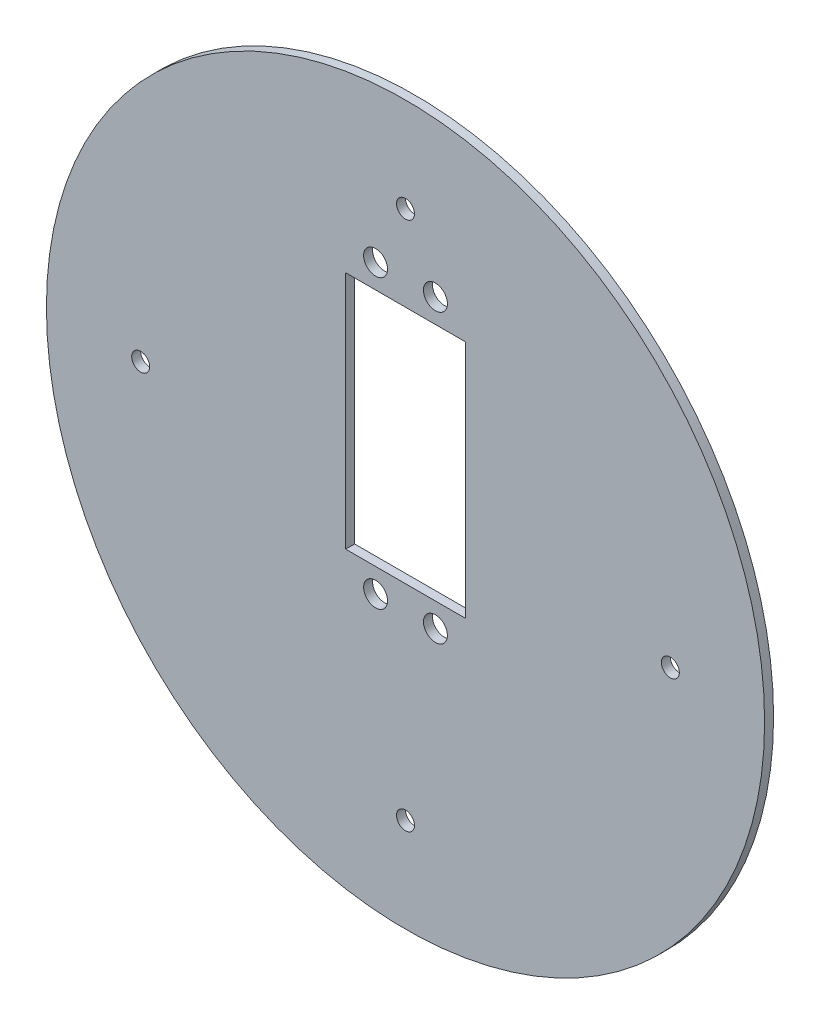
ISO-10303-21;
HEADER;
FILE_DESCRIPTION(('STEP AP214'),'2;1');
FILE_NAME('part.step','',(''),(''),'','','');
FILE_SCHEMA(('AUTOMOTIVE_DESIGN { 1 0 10303 214 1 1 1 1 }'));
ENDSEC;
DATA;
#1=APPLICATION_CONTEXT('core data for automotive mechanical design processes');
#2=APPLICATION_PROTOCOL_DEFINITION('international standard','automotive_design',2000,#1);
#3=PRODUCT_CONTEXT('',#1,'mechanical');
#4=PRODUCT('Part','Part','',(#3));
#5=PRODUCT_RELATED_PRODUCT_CATEGORY('part','',(#4));
#6=PRODUCT_DEFINITION_FORMATION('','',#4);
#7=PRODUCT_DEFINITION_CONTEXT('part definition',#1,'design');
#8=PRODUCT_DEFINITION('design','',#6,#7);
#9=PRODUCT_DEFINITION_SHAPE('','',#8);
#10=(LENGTH_UNIT() NAMED_UNIT(*) SI_UNIT(.MILLI.,.METRE.));
#11=(NAMED_UNIT(*) PLANE_ANGLE_UNIT() SI_UNIT($,.RADIAN.));
#12=(NAMED_UNIT(*) SI_UNIT($,.STERADIAN.) SOLID_ANGLE_UNIT());
#13=UNCERTAINTY_MEASURE_WITH_UNIT(LENGTH_MEASURE(1.E-05),#10,'distance_accuracy_value','');
#14=(GEOMETRIC_REPRESENTATION_CONTEXT(3) GLOBAL_UNCERTAINTY_ASSIGNED_CONTEXT((#13)) GLOBAL_UNIT_ASSIGNED_CONTEXT((#10,
#11,#12)) REPRESENTATION_CONTEXT('',''));
#15=CARTESIAN_POINT('',(0.,0.,0.));
#16=DIRECTION('',(0.,0.,1.));
#17=DIRECTION('',(1.,0.,0.));
#18=AXIS2_PLACEMENT_3D('',#15,#16,#17);
#19=CARTESIAN_POINT('',(0.,0.,1.5));
#20=DIRECTION('',(0.,0.,1.));
#21=DIRECTION('',(1.,0.,0.));
#22=AXIS2_PLACEMENT_3D('',#19,#20,#21);
#23=PLANE('',#22);
#24=CARTESIAN_POINT('',(2.49906409833207E-12,-44.25,1.5));
#25=DIRECTION('',(0.,0.,1.));
#26=DIRECTION('',(1.,0.,0.));
#27=AXIS2_PLACEMENT_3D('',#24,#25,#26);
#28=CIRCLE('',#27,1.50000000000269);
#29=CARTESIAN_POINT('',(1.50000000000519,-44.25,1.5));
#30=VERTEX_POINT('',#29);
#31=EDGE_CURVE('E252',#30,#30,#28,.T.);
#32=ORIENTED_EDGE('',*,*,#31,.F.);
#33=EDGE_LOOP('',(#32));
#34=FACE_BOUND('',#33,.T.);
#35=CARTESIAN_POINT('',(-5.,-14.,1.5));
#36=DIRECTION('',(0.,0.,1.));
#37=DIRECTION('',(1.,0.,0.));
#38=AXIS2_PLACEMENT_3D('',#35,#36,#37);
#39=CIRCLE('',#38,2.);
#40=CARTESIAN_POINT('',(-3.,-14.,1.5));
#41=VERTEX_POINT('',#40);
#42=EDGE_CURVE('E264',#41,#41,#39,.T.);
#43=ORIENTED_EDGE('',*,*,#42,.F.);
#44=EDGE_LOOP('',(#43));
#45=FACE_BOUND('',#44,.T.);
#46=CARTESIAN_POINT('',(-5.,34.,1.5));
#47=DIRECTION('',(0.,0.,1.));
#48=DIRECTION('',(1.,0.,0.));
#49=AXIS2_PLACEMENT_3D('',#46,#47,#48);
#50=CIRCLE('',#49,2.);
#51=CARTESIAN_POINT('',(-3.,34.,1.5));
#52=VERTEX_POINT('',#51);
#53=EDGE_CURVE('E276',#52,#52,#50,.T.);
#54=ORIENTED_EDGE('',*,*,#53,.F.);
#55=EDGE_LOOP('',(#54));
#56=FACE_BOUND('',#55,.T.);
#57=CARTESIAN_POINT('',(0.,44.25,1.5));
#58=DIRECTION('',(0.,0.,1.));
#59=DIRECTION('',(1.,0.,0.));
#60=AXIS2_PLACEMENT_3D('',#57,#58,#59);
#61=CIRCLE('',#60,1.5);
#62=CARTESIAN_POINT('',(1.5,44.25,1.5));
#63=VERTEX_POINT('',#62);
#64=EDGE_CURVE('E108',#63,#63,#61,.T.);
#65=ORIENTED_EDGE('',*,*,#64,.F.);
#66=EDGE_LOOP('',(#65));
#67=FACE_BOUND('',#66,.T.);
#68=CARTESIAN_POINT('',(0.,0.,1.5));
#69=DIRECTION('',(0.,0.,1.));
#70=DIRECTION('',(1.,0.,0.));
#71=AXIS2_PLACEMENT_3D('',#68,#69,#70);
#72=CIRCLE('',#71,60.);
#73=CARTESIAN_POINT('',(60.,0.,1.5));
#74=VERTEX_POINT('',#73);
#75=EDGE_CURVE('E11',#74,#74,#72,.T.);
#76=ORIENTED_EDGE('',*,*,#75,.T.);
#77=EDGE_LOOP('',(#76));
#78=FACE_BOUND('',#77,.T.);
#79=DIRECTION('',(-1.,0.,0.));
#80=VECTOR('',#79,1.);
#81=CARTESIAN_POINT('',(-10.,30.,1.5));
#82=LINE('',#81,#80);
#83=CARTESIAN_POINT('',(10.,30.,1.5));
#84=VERTEX_POINT('',#83);
#85=CARTESIAN_POINT('',(-10.,30.,1.5));
#86=VERTEX_POINT('',#85);
#87=EDGE_CURVE('E88',#84,#86,#82,.T.);
#88=ORIENTED_EDGE('',*,*,#87,.F.);
#89=DIRECTION('',(0.,1.,0.));
#90=VECTOR('',#89,1.);
#91=CARTESIAN_POINT('',(10.,30.,1.5));
#92=LINE('',#91,#90);
#93=CARTESIAN_POINT('',(10.,-10.,1.5));
#94=VERTEX_POINT('',#93);
#95=EDGE_CURVE('E80',#94,#84,#92,.T.);
#96=ORIENTED_EDGE('',*,*,#95,.F.);
#97=DIRECTION('',(1.,0.,0.));
#98=VECTOR('',#97,1.);
#99=CARTESIAN_POINT('',(10.,-10.,1.5));
#100=LINE('',#99,#98);
#101=CARTESIAN_POINT('',(-10.,-10.,1.5));
#102=VERTEX_POINT('',#101);
#103=EDGE_CURVE('E102',#102,#94,#100,.T.);
#104=ORIENTED_EDGE('',*,*,#103,.F.);
#105=DIRECTION('',(0.,-1.,0.));
#106=VECTOR('',#105,1.);
#107=CARTESIAN_POINT('',(-10.,-10.,1.5));
#108=LINE('',#107,#106);
#109=EDGE_CURVE('E100',#86,#102,#108,.T.);
#110=ORIENTED_EDGE('',*,*,#109,.F.);
#111=EDGE_LOOP('',(#88,#96,#104,#110));
#112=FACE_BOUND('',#111,.T.);
#113=CARTESIAN_POINT('',(5.,34.,1.5));
#114=DIRECTION('',(0.,0.,1.));
#115=DIRECTION('',(1.,0.,0.));
#116=AXIS2_PLACEMENT_3D('',#113,#114,#115);
#117=CIRCLE('',#116,2.);
#118=CARTESIAN_POINT('',(7.,34.,1.5));
#119=VERTEX_POINT('',#118);
#120=EDGE_CURVE('E282',#119,#119,#117,.T.);
#121=ORIENTED_EDGE('',*,*,#120,.F.);
#122=EDGE_LOOP('',(#121));
#123=FACE_BOUND('',#122,.T.);
#124=CARTESIAN_POINT('',(5.,-14.,1.5));
#125=DIRECTION('',(0.,0.,1.));
#126=DIRECTION('',(1.,0.,0.));
#127=AXIS2_PLACEMENT_3D('',#124,#125,#126);
#128=CIRCLE('',#127,2.);
#129=CARTESIAN_POINT('',(7.,-14.,1.5));
#130=VERTEX_POINT('',#129);
#131=EDGE_CURVE('E270',#130,#130,#128,.T.);
#132=ORIENTED_EDGE('',*,*,#131,.F.);
#133=EDGE_LOOP('',(#132));
#134=FACE_BOUND('',#133,.T.);
#135=CARTESIAN_POINT('',(44.2500000000012,1.24953204916604E-12,1.5));
#136=DIRECTION('',(0.,0.,1.));
#137=DIRECTION('',(1.,0.,0.));
#138=AXIS2_PLACEMENT_3D('',#135,#136,#137);
#139=CIRCLE('',#138,1.50000000000098);
#140=CARTESIAN_POINT('',(45.7500000000022,1.24953204916604E-12,1.5));
#141=VERTEX_POINT('',#140);
#142=EDGE_CURVE('E258',#141,#141,#139,.T.);
#143=ORIENTED_EDGE('',*,*,#142,.F.);
#144=EDGE_LOOP('',(#143));
#145=FACE_BOUND('',#144,.T.);
#146=CARTESIAN_POINT('',(-44.2499999999987,-1.25495111125226E-12,1.5));
#147=DIRECTION('',(0.,0.,1.));
#148=DIRECTION('',(1.,0.,0.));
#149=AXIS2_PLACEMENT_3D('',#146,#147,#148);
#150=CIRCLE('',#149,1.50000000000201);
#151=CARTESIAN_POINT('',(-42.7499999999967,-1.25495111125226E-12,1.5));
#152=VERTEX_POINT('',#151);
#153=EDGE_CURVE('E243',#152,#152,#150,.T.);
#154=ORIENTED_EDGE('',*,*,#153,.F.);
#155=EDGE_LOOP('',(#154));
#156=FACE_BOUND('',#155,.T.);
#157=ADVANCED_FACE('F39',(#34,#45,#56,#67,#78,#112,#123,#134,#145,#156),#23,.T.);
#158=CARTESIAN_POINT('',(0.,0.,0.));
#159=DIRECTION('',(0.,0.,1.));
#160=DIRECTION('',(1.,0.,0.));
#161=AXIS2_PLACEMENT_3D('',#158,#159,#160);
#162=PLANE('',#161);
#163=CARTESIAN_POINT('',(0.,0.,0.));
#164=DIRECTION('',(0.,0.,1.));
#165=DIRECTION('',(1.,0.,0.));
#166=AXIS2_PLACEMENT_3D('',#163,#164,#165);
#167=CIRCLE('',#166,60.);
#168=CARTESIAN_POINT('',(60.,0.,0.));
#169=VERTEX_POINT('',#168);
#170=EDGE_CURVE('E43',#169,#169,#167,.T.);
#171=ORIENTED_EDGE('',*,*,#170,.F.);
#172=EDGE_LOOP('',(#171));
#173=FACE_BOUND('',#172,.T.);
#174=DIRECTION('',(0.,1.,0.));
#175=VECTOR('',#174,1.);
#176=CARTESIAN_POINT('',(10.,30.,0.));
#177=LINE('',#176,#175);
#178=CARTESIAN_POINT('',(10.,-10.,0.));
#179=VERTEX_POINT('',#178);
#180=CARTESIAN_POINT('',(10.,30.,0.));
#181=VERTEX_POINT('',#180);
#182=EDGE_CURVE('E62',#179,#181,#177,.T.);
#183=ORIENTED_EDGE('',*,*,#182,.T.);
#184=DIRECTION('',(-1.,0.,0.));
#185=VECTOR('',#184,1.);
#186=CARTESIAN_POINT('',(-10.,30.,0.));
#187=LINE('',#186,#185);
#188=CARTESIAN_POINT('',(-10.,30.,0.));
#189=VERTEX_POINT('',#188);
#190=EDGE_CURVE('E95',#181,#189,#187,.T.);
#191=ORIENTED_EDGE('',*,*,#190,.T.);
#192=DIRECTION('',(0.,-1.,0.));
#193=VECTOR('',#192,1.);
#194=CARTESIAN_POINT('',(-10.,-10.,0.));
#195=LINE('',#194,#193);
#196=CARTESIAN_POINT('',(-10.,-10.,0.));
#197=VERTEX_POINT('',#196);
#198=EDGE_CURVE('E110',#189,#197,#195,.T.);
#199=ORIENTED_EDGE('',*,*,#198,.T.);
#200=DIRECTION('',(1.,0.,0.));
#201=VECTOR('',#200,1.);
#202=CARTESIAN_POINT('',(10.,-10.,0.));
#203=LINE('',#202,#201);
#204=EDGE_CURVE('E89',#197,#179,#203,.T.);
#205=ORIENTED_EDGE('',*,*,#204,.T.);
#206=EDGE_LOOP('',(#183,#191,#199,#205));
#207=FACE_BOUND('',#206,.T.);
#208=CARTESIAN_POINT('',(0.,44.25,0.));
#209=DIRECTION('',(0.,0.,1.));
#210=DIRECTION('',(1.,0.,0.));
#211=AXIS2_PLACEMENT_3D('',#208,#209,#210);
#212=CIRCLE('',#211,1.5);
#213=CARTESIAN_POINT('',(1.5,44.25,0.));
#214=VERTEX_POINT('',#213);
#215=EDGE_CURVE('E285',#214,#214,#212,.T.);
#216=ORIENTED_EDGE('',*,*,#215,.T.);
#217=EDGE_LOOP('',(#216));
#218=FACE_BOUND('',#217,.T.);
#219=CARTESIAN_POINT('',(5.,34.,0.));
#220=DIRECTION('',(0.,0.,1.));
#221=DIRECTION('',(1.,0.,0.));
#222=AXIS2_PLACEMENT_3D('',#219,#220,#221);
#223=CIRCLE('',#222,2.);
#224=CARTESIAN_POINT('',(7.,34.,0.));
#225=VERTEX_POINT('',#224);
#226=EDGE_CURVE('E279',#225,#225,#223,.T.);
#227=ORIENTED_EDGE('',*,*,#226,.T.);
#228=EDGE_LOOP('',(#227));
#229=FACE_BOUND('',#228,.T.);
#230=CARTESIAN_POINT('',(-5.,34.,0.));
#231=DIRECTION('',(0.,0.,1.));
#232=DIRECTION('',(1.,0.,0.));
#233=AXIS2_PLACEMENT_3D('',#230,#231,#232);
#234=CIRCLE('',#233,2.);
#235=CARTESIAN_POINT('',(-3.,34.,0.));
#236=VERTEX_POINT('',#235);
#237=EDGE_CURVE('E273',#236,#236,#234,.T.);
#238=ORIENTED_EDGE('',*,*,#237,.T.);
#239=EDGE_LOOP('',(#238));
#240=FACE_BOUND('',#239,.T.);
#241=CARTESIAN_POINT('',(5.,-14.,0.));
#242=DIRECTION('',(0.,0.,1.));
#243=DIRECTION('',(1.,0.,0.));
#244=AXIS2_PLACEMENT_3D('',#241,#242,#243);
#245=CIRCLE('',#244,2.);
#246=CARTESIAN_POINT('',(7.,-14.,0.));
#247=VERTEX_POINT('',#246);
#248=EDGE_CURVE('E267',#247,#247,#245,.T.);
#249=ORIENTED_EDGE('',*,*,#248,.T.);
#250=EDGE_LOOP('',(#249));
#251=FACE_BOUND('',#250,.T.);
#252=CARTESIAN_POINT('',(-5.,-14.,0.));
#253=DIRECTION('',(0.,0.,1.));
#254=DIRECTION('',(1.,0.,0.));
#255=AXIS2_PLACEMENT_3D('',#252,#253,#254);
#256=CIRCLE('',#255,2.);
#257=CARTESIAN_POINT('',(-3.,-14.,0.));
#258=VERTEX_POINT('',#257);
#259=EDGE_CURVE('E261',#258,#258,#256,.T.);
#260=ORIENTED_EDGE('',*,*,#259,.T.);
#261=EDGE_LOOP('',(#260));
#262=FACE_BOUND('',#261,.T.);
#263=CARTESIAN_POINT('',(44.2500000000012,1.24953204916604E-12,0.));
#264=DIRECTION('',(0.,0.,1.));
#265=DIRECTION('',(1.,0.,0.));
#266=AXIS2_PLACEMENT_3D('',#263,#264,#265);
#267=CIRCLE('',#266,1.50000000000098);
#268=CARTESIAN_POINT('',(45.7500000000022,1.24953204916604E-12,0.));
#269=VERTEX_POINT('',#268);
#270=EDGE_CURVE('E255',#269,#269,#267,.T.);
#271=ORIENTED_EDGE('',*,*,#270,.T.);
#272=EDGE_LOOP('',(#271));
#273=FACE_BOUND('',#272,.T.);
#274=CARTESIAN_POINT('',(2.49906409833207E-12,-44.25,0.));
#275=DIRECTION('',(0.,0.,1.));
#276=DIRECTION('',(1.,0.,0.));
#277=AXIS2_PLACEMENT_3D('',#274,#275,#276);
#278=CIRCLE('',#277,1.50000000000269);
#279=CARTESIAN_POINT('',(1.50000000000519,-44.25,0.));
#280=VERTEX_POINT('',#279);
#281=EDGE_CURVE('E249',#280,#280,#278,.T.);
#282=ORIENTED_EDGE('',*,*,#281,.T.);
#283=EDGE_LOOP('',(#282));
#284=FACE_BOUND('',#283,.T.);
#285=CARTESIAN_POINT('',(-44.2499999999987,-1.25495111125226E-12,0.));
#286=DIRECTION('',(0.,0.,1.));
#287=DIRECTION('',(1.,0.,0.));
#288=AXIS2_PLACEMENT_3D('',#285,#286,#287);
#289=CIRCLE('',#288,1.50000000000201);
#290=CARTESIAN_POINT('',(-42.7499999999967,-1.25495111125226E-12,0.));
#291=VERTEX_POINT('',#290);
#292=EDGE_CURVE('E246',#291,#291,#289,.T.);
#293=ORIENTED_EDGE('',*,*,#292,.T.);
#294=EDGE_LOOP('',(#293));
#295=FACE_BOUND('',#294,.T.);
#296=ADVANCED_FACE('F121',(#173,#207,#218,#229,#240,#251,#262,#273,#284,#295),#162,.F.);
#297=CARTESIAN_POINT('',(0.,0.,1.5));
#298=DIRECTION('',(0.,0.,-1.));
#299=DIRECTION('',(-1.,0.,0.));
#300=AXIS2_PLACEMENT_3D('',#297,#298,#299);
#301=CYLINDRICAL_SURFACE('',#300,60.);
#302=ORIENTED_EDGE('',*,*,#75,.F.);
#303=EDGE_LOOP('',(#302));
#304=FACE_BOUND('',#303,.T.);
#305=ORIENTED_EDGE('',*,*,#170,.T.);
#306=EDGE_LOOP('',(#305));
#307=FACE_BOUND('',#306,.T.);
#308=ADVANCED_FACE('F41',(#304,#307),#301,.T.);
#309=CARTESIAN_POINT('',(10.,30.,1.5));
#310=DIRECTION('',(-1.,0.,0.));
#311=DIRECTION('',(0.,-1.,0.));
#312=AXIS2_PLACEMENT_3D('',#309,#310,#311);
#313=PLANE('',#312);
#314=ORIENTED_EDGE('',*,*,#182,.F.);
#315=DIRECTION('',(0.,0.,-1.));
#316=VECTOR('',#315,1.);
#317=CARTESIAN_POINT('',(10.,-10.,1.5));
#318=LINE('',#317,#316);
#319=EDGE_CURVE('E84',#94,#179,#318,.T.);
#320=ORIENTED_EDGE('',*,*,#319,.F.);
#321=ORIENTED_EDGE('',*,*,#95,.T.);
#322=DIRECTION('',(0.,0.,-1.));
#323=VECTOR('',#322,1.);
#324=CARTESIAN_POINT('',(10.,30.,1.5));
#325=LINE('',#324,#323);
#326=EDGE_CURVE('E83',#84,#181,#325,.T.);
#327=ORIENTED_EDGE('',*,*,#326,.T.);
#328=EDGE_LOOP('',(#314,#320,#321,#327));
#329=FACE_BOUND('',#328,.T.);
#330=ADVANCED_FACE('F82',(#329),#313,.T.);
#331=CARTESIAN_POINT('',(-10.,30.,1.5));
#332=DIRECTION('',(0.,-1.,0.));
#333=DIRECTION('',(0.,0.,-1.));
#334=AXIS2_PLACEMENT_3D('',#331,#332,#333);
#335=PLANE('',#334);
#336=ORIENTED_EDGE('',*,*,#190,.F.);
#337=ORIENTED_EDGE('',*,*,#326,.F.);
#338=ORIENTED_EDGE('',*,*,#87,.T.);
#339=DIRECTION('',(0.,0.,-1.));
#340=VECTOR('',#339,1.);
#341=CARTESIAN_POINT('',(-10.,30.,1.5));
#342=LINE('',#341,#340);
#343=EDGE_CURVE('E96',#86,#189,#342,.T.);
#344=ORIENTED_EDGE('',*,*,#343,.T.);
#345=EDGE_LOOP('',(#336,#337,#338,#344));
#346=FACE_BOUND('',#345,.T.);
#347=ADVANCED_FACE('F92',(#346),#335,.T.);
#348=CARTESIAN_POINT('',(-10.,-10.,1.5));
#349=DIRECTION('',(1.,0.,0.));
#350=DIRECTION('',(0.,0.,-1.));
#351=AXIS2_PLACEMENT_3D('',#348,#349,#350);
#352=PLANE('',#351);
#353=ORIENTED_EDGE('',*,*,#198,.F.);
#354=ORIENTED_EDGE('',*,*,#343,.F.);
#355=ORIENTED_EDGE('',*,*,#109,.T.);
#356=DIRECTION('',(0.,0.,-1.));
#357=VECTOR('',#356,1.);
#358=CARTESIAN_POINT('',(-10.,-10.,1.5));
#359=LINE('',#358,#357);
#360=EDGE_CURVE('E54',#102,#197,#359,.T.);
#361=ORIENTED_EDGE('',*,*,#360,.T.);
#362=EDGE_LOOP('',(#353,#354,#355,#361));
#363=FACE_BOUND('',#362,.T.);
#364=ADVANCED_FACE('F119',(#363),#352,.T.);
#365=CARTESIAN_POINT('',(10.,-10.,1.5));
#366=DIRECTION('',(0.,1.,0.));
#367=DIRECTION('',(-1.,0.,0.));
#368=AXIS2_PLACEMENT_3D('',#365,#366,#367);
#369=PLANE('',#368);
#370=ORIENTED_EDGE('',*,*,#204,.F.);
#371=ORIENTED_EDGE('',*,*,#360,.F.);
#372=ORIENTED_EDGE('',*,*,#103,.T.);
#373=ORIENTED_EDGE('',*,*,#319,.T.);
#374=EDGE_LOOP('',(#370,#371,#372,#373));
#375=FACE_BOUND('',#374,.T.);
#376=ADVANCED_FACE('F123',(#375),#369,.T.);
#377=CARTESIAN_POINT('',(0.,44.25,1.5));
#378=DIRECTION('',(0.,0.,-1.));
#379=DIRECTION('',(-1.,0.,0.));
#380=AXIS2_PLACEMENT_3D('',#377,#378,#379);
#381=CYLINDRICAL_SURFACE('',#380,1.5);
#382=ORIENTED_EDGE('',*,*,#64,.T.);
#383=EDGE_LOOP('',(#382));
#384=FACE_BOUND('',#383,.T.);
#385=ORIENTED_EDGE('',*,*,#215,.F.);
#386=EDGE_LOOP('',(#385));
#387=FACE_BOUND('',#386,.T.);
#388=ADVANCED_FACE('F125',(#384,#387),#381,.F.);
#389=CARTESIAN_POINT('',(5.,34.,1.5));
#390=DIRECTION('',(0.,0.,-1.));
#391=DIRECTION('',(-1.,0.,0.));
#392=AXIS2_PLACEMENT_3D('',#389,#390,#391);
#393=CYLINDRICAL_SURFACE('',#392,2.);
#394=ORIENTED_EDGE('',*,*,#120,.T.);
#395=EDGE_LOOP('',(#394));
#396=FACE_BOUND('',#395,.T.);
#397=ORIENTED_EDGE('',*,*,#226,.F.);
#398=EDGE_LOOP('',(#397));
#399=FACE_BOUND('',#398,.T.);
#400=ADVANCED_FACE('F131',(#396,#399),#393,.F.);
#401=CARTESIAN_POINT('',(-5.,34.,1.5));
#402=DIRECTION('',(0.,0.,-1.));
#403=DIRECTION('',(-1.,0.,0.));
#404=AXIS2_PLACEMENT_3D('',#401,#402,#403);
#405=CYLINDRICAL_SURFACE('',#404,2.);
#406=ORIENTED_EDGE('',*,*,#53,.T.);
#407=EDGE_LOOP('',(#406));
#408=FACE_BOUND('',#407,.T.);
#409=ORIENTED_EDGE('',*,*,#237,.F.);
#410=EDGE_LOOP('',(#409));
#411=FACE_BOUND('',#410,.T.);
#412=ADVANCED_FACE('F176',(#408,#411),#405,.F.);
#413=CARTESIAN_POINT('',(5.,-14.,1.5));
#414=DIRECTION('',(0.,0.,-1.));
#415=DIRECTION('',(-1.,0.,0.));
#416=AXIS2_PLACEMENT_3D('',#413,#414,#415);
#417=CYLINDRICAL_SURFACE('',#416,2.);
#418=ORIENTED_EDGE('',*,*,#131,.T.);
#419=EDGE_LOOP('',(#418));
#420=FACE_BOUND('',#419,.T.);
#421=ORIENTED_EDGE('',*,*,#248,.F.);
#422=EDGE_LOOP('',(#421));
#423=FACE_BOUND('',#422,.T.);
#424=ADVANCED_FACE('F186',(#420,#423),#417,.F.);
#425=CARTESIAN_POINT('',(-5.,-14.,1.5));
#426=DIRECTION('',(0.,0.,-1.));
#427=DIRECTION('',(-1.,0.,0.));
#428=AXIS2_PLACEMENT_3D('',#425,#426,#427);
#429=CYLINDRICAL_SURFACE('',#428,2.);
#430=ORIENTED_EDGE('',*,*,#42,.T.);
#431=EDGE_LOOP('',(#430));
#432=FACE_BOUND('',#431,.T.);
#433=ORIENTED_EDGE('',*,*,#259,.F.);
#434=EDGE_LOOP('',(#433));
#435=FACE_BOUND('',#434,.T.);
#436=ADVANCED_FACE('F196',(#432,#435),#429,.F.);
#437=CARTESIAN_POINT('',(44.2500000000012,1.24953204916604E-12,1.5));
#438=DIRECTION('',(0.,0.,-1.));
#439=DIRECTION('',(-1.,0.,0.));
#440=AXIS2_PLACEMENT_3D('',#437,#438,#439);
#441=CYLINDRICAL_SURFACE('',#440,1.50000000000098);
#442=ORIENTED_EDGE('',*,*,#142,.T.);
#443=EDGE_LOOP('',(#442));
#444=FACE_BOUND('',#443,.T.);
#445=ORIENTED_EDGE('',*,*,#270,.F.);
#446=EDGE_LOOP('',(#445));
#447=FACE_BOUND('',#446,.T.);
#448=ADVANCED_FACE('F206',(#444,#447),#441,.F.);
#449=CARTESIAN_POINT('',(2.49906409833207E-12,-44.25,1.5));
#450=DIRECTION('',(0.,0.,-1.));
#451=DIRECTION('',(-1.,0.,0.));
#452=AXIS2_PLACEMENT_3D('',#449,#450,#451);
#453=CYLINDRICAL_SURFACE('',#452,1.50000000000269);
#454=ORIENTED_EDGE('',*,*,#31,.T.);
#455=EDGE_LOOP('',(#454));
#456=FACE_BOUND('',#455,.T.);
#457=ORIENTED_EDGE('',*,*,#281,.F.);
#458=EDGE_LOOP('',(#457));
#459=FACE_BOUND('',#458,.T.);
#460=ADVANCED_FACE('F216',(#456,#459),#453,.F.);
#461=CARTESIAN_POINT('',(-44.2499999999987,-1.25495111125226E-12,1.5));
#462=DIRECTION('',(0.,0.,-1.));
#463=DIRECTION('',(-1.,0.,0.));
#464=AXIS2_PLACEMENT_3D('',#461,#462,#463);
#465=CYLINDRICAL_SURFACE('',#464,1.50000000000201);
#466=ORIENTED_EDGE('',*,*,#153,.T.);
#467=EDGE_LOOP('',(#466));
#468=FACE_BOUND('',#467,.T.);
#469=ORIENTED_EDGE('',*,*,#292,.F.);
#470=EDGE_LOOP('',(#469));
#471=FACE_BOUND('',#470,.T.);
#472=ADVANCED_FACE('F226',(#468,#471),#465,.F.);
#473=CLOSED_SHELL('',(#157,#296,#308,#330,#347,#364,#376,#388,#400,#412,#424,#436,#448,#460,#472));
#474=MANIFOLD_SOLID_BREP('B2',#473);
#475=ADVANCED_BREP_SHAPE_REPRESENTATION('',(#18,#474),#14);
#476=SHAPE_DEFINITION_REPRESENTATION(#9,#475);
ENDSEC;
END-ISO-10303-21;
